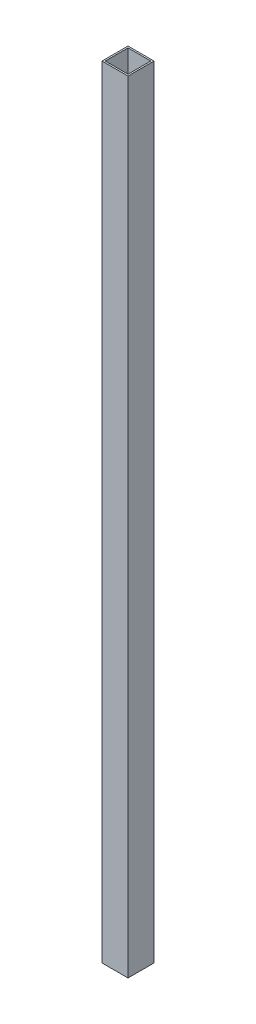
ISO-10303-21;
HEADER;
FILE_DESCRIPTION(('STEP AP214'),'2;1');
FILE_NAME('part.step','',(''),(''),'','','');
FILE_SCHEMA(('AUTOMOTIVE_DESIGN { 1 0 10303 214 1 1 1 1 }'));
ENDSEC;
DATA;
#1=APPLICATION_CONTEXT('core data for automotive mechanical design processes');
#2=APPLICATION_PROTOCOL_DEFINITION('international standard','automotive_design',2000,#1);
#3=PRODUCT_CONTEXT('',#1,'mechanical');
#4=PRODUCT('Part','Part','',(#3));
#5=PRODUCT_RELATED_PRODUCT_CATEGORY('part','',(#4));
#6=PRODUCT_DEFINITION_FORMATION('','',#4);
#7=PRODUCT_DEFINITION_CONTEXT('part definition',#1,'design');
#8=PRODUCT_DEFINITION('design','',#6,#7);
#9=PRODUCT_DEFINITION_SHAPE('','',#8);
#10=(LENGTH_UNIT() NAMED_UNIT(*) SI_UNIT(.MILLI.,.METRE.));
#11=(NAMED_UNIT(*) PLANE_ANGLE_UNIT() SI_UNIT($,.RADIAN.));
#12=(NAMED_UNIT(*) SI_UNIT($,.STERADIAN.) SOLID_ANGLE_UNIT());
#13=UNCERTAINTY_MEASURE_WITH_UNIT(LENGTH_MEASURE(1.E-05),#10,'distance_accuracy_value','');
#14=(GEOMETRIC_REPRESENTATION_CONTEXT(3) GLOBAL_UNCERTAINTY_ASSIGNED_CONTEXT((#13)) GLOBAL_UNIT_ASSIGNED_CONTEXT((#10,
#11,#12)) REPRESENTATION_CONTEXT('',''));
#15=CARTESIAN_POINT('',(0.,0.,0.));
#16=DIRECTION('',(0.,0.,1.));
#17=DIRECTION('',(1.,0.,0.));
#18=AXIS2_PLACEMENT_3D('',#15,#16,#17);
#19=CARTESIAN_POINT('',(0.,762.,0.));
#20=DIRECTION('',(0.,-1.,0.));
#21=DIRECTION('',(0.,0.,-1.));
#22=AXIS2_PLACEMENT_3D('',#19,#20,#21);
#23=PLANE('',#22);
#24=DIRECTION('',(0.,0.,1.));
#25=VECTOR('',#24,1.);
#26=CARTESIAN_POINT('',(0.,762.,0.));
#27=LINE('',#26,#25);
#28=CARTESIAN_POINT('',(0.,762.,-25.4));
#29=VERTEX_POINT('',#28);
#30=CARTESIAN_POINT('',(0.,762.,0.));
#31=VERTEX_POINT('',#30);
#32=EDGE_CURVE('E134',#29,#31,#27,.T.);
#33=ORIENTED_EDGE('',*,*,#32,.T.);
#34=DIRECTION('',(1.,0.,0.));
#35=VECTOR('',#34,1.);
#36=CARTESIAN_POINT('',(0.,762.,0.));
#37=LINE('',#36,#35);
#38=CARTESIAN_POINT('',(25.4,762.,0.));
#39=VERTEX_POINT('',#38);
#40=EDGE_CURVE('E137',#31,#39,#37,.T.);
#41=ORIENTED_EDGE('',*,*,#40,.T.);
#42=DIRECTION('',(0.,0.,-1.));
#43=VECTOR('',#42,1.);
#44=CARTESIAN_POINT('',(25.4,762.,0.));
#45=LINE('',#44,#43);
#46=CARTESIAN_POINT('',(25.4,762.,-25.4));
#47=VERTEX_POINT('',#46);
#48=EDGE_CURVE('E140',#39,#47,#45,.T.);
#49=ORIENTED_EDGE('',*,*,#48,.T.);
#50=DIRECTION('',(-1.,0.,0.));
#51=VECTOR('',#50,1.);
#52=CARTESIAN_POINT('',(0.,762.,-25.4));
#53=LINE('',#52,#51);
#54=EDGE_CURVE('E142',#47,#29,#53,.T.);
#55=ORIENTED_EDGE('',*,*,#54,.T.);
#56=EDGE_LOOP('',(#33,#41,#49,#55));
#57=FACE_BOUND('',#56,.T.);
#58=DIRECTION('',(0.,0.,1.));
#59=VECTOR('',#58,1.);
#60=CARTESIAN_POINT('',(1.5875,762.,-23.8125));
#61=LINE('',#60,#59);
#62=CARTESIAN_POINT('',(1.5875,762.,-23.8125));
#63=VERTEX_POINT('',#62);
#64=CARTESIAN_POINT('',(1.5875,762.,-1.5875));
#65=VERTEX_POINT('',#64);
#66=EDGE_CURVE('E98',#63,#65,#61,.T.);
#67=ORIENTED_EDGE('',*,*,#66,.F.);
#68=DIRECTION('',(-1.,0.,0.));
#69=VECTOR('',#68,1.);
#70=CARTESIAN_POINT('',(1.5875,762.,-23.8125));
#71=LINE('',#70,#69);
#72=CARTESIAN_POINT('',(23.8125,762.,-23.8125));
#73=VERTEX_POINT('',#72);
#74=EDGE_CURVE('E120',#73,#63,#71,.T.);
#75=ORIENTED_EDGE('',*,*,#74,.F.);
#76=DIRECTION('',(0.,0.,-1.));
#77=VECTOR('',#76,1.);
#78=CARTESIAN_POINT('',(23.8125,762.,-23.8125));
#79=LINE('',#78,#77);
#80=CARTESIAN_POINT('',(23.8125,762.,-1.5875));
#81=VERTEX_POINT('',#80);
#82=EDGE_CURVE('E118',#81,#73,#79,.T.);
#83=ORIENTED_EDGE('',*,*,#82,.F.);
#84=DIRECTION('',(1.,0.,0.));
#85=VECTOR('',#84,1.);
#86=CARTESIAN_POINT('',(1.5875,762.,-1.5875));
#87=LINE('',#86,#85);
#88=EDGE_CURVE('E106',#65,#81,#87,.T.);
#89=ORIENTED_EDGE('',*,*,#88,.F.);
#90=EDGE_LOOP('',(#67,#75,#83,#89));
#91=FACE_BOUND('',#90,.T.);
#92=ADVANCED_FACE('F33',(#57,#91),#23,.F.);
#93=CARTESIAN_POINT('',(0.,0.,0.));
#94=DIRECTION('',(0.,-1.,0.));
#95=DIRECTION('',(0.,0.,-1.));
#96=AXIS2_PLACEMENT_3D('',#93,#94,#95);
#97=PLANE('',#96);
#98=DIRECTION('',(0.,0.,1.));
#99=VECTOR('',#98,1.);
#100=CARTESIAN_POINT('',(0.,0.,0.));
#101=LINE('',#100,#99);
#102=CARTESIAN_POINT('',(0.,0.,-25.4));
#103=VERTEX_POINT('',#102);
#104=CARTESIAN_POINT('',(0.,0.,0.));
#105=VERTEX_POINT('',#104);
#106=EDGE_CURVE('E114',#103,#105,#101,.T.);
#107=ORIENTED_EDGE('',*,*,#106,.F.);
#108=DIRECTION('',(-1.,0.,0.));
#109=VECTOR('',#108,1.);
#110=CARTESIAN_POINT('',(0.,0.,-25.4));
#111=LINE('',#110,#109);
#112=CARTESIAN_POINT('',(25.4,0.,-25.4));
#113=VERTEX_POINT('',#112);
#114=EDGE_CURVE('E138',#113,#103,#111,.T.);
#115=ORIENTED_EDGE('',*,*,#114,.F.);
#116=DIRECTION('',(0.,0.,-1.));
#117=VECTOR('',#116,1.);
#118=CARTESIAN_POINT('',(25.4,0.,0.));
#119=LINE('',#118,#117);
#120=CARTESIAN_POINT('',(25.4,0.,0.));
#121=VERTEX_POINT('',#120);
#122=EDGE_CURVE('E149',#121,#113,#119,.T.);
#123=ORIENTED_EDGE('',*,*,#122,.F.);
#124=DIRECTION('',(1.,0.,0.));
#125=VECTOR('',#124,1.);
#126=CARTESIAN_POINT('',(0.,0.,0.));
#127=LINE('',#126,#125);
#128=EDGE_CURVE('E147',#105,#121,#127,.T.);
#129=ORIENTED_EDGE('',*,*,#128,.F.);
#130=EDGE_LOOP('',(#107,#115,#123,#129));
#131=FACE_BOUND('',#130,.T.);
#132=DIRECTION('',(-1.,0.,0.));
#133=VECTOR('',#132,1.);
#134=CARTESIAN_POINT('',(1.5875,0.,-23.8125));
#135=LINE('',#134,#133);
#136=CARTESIAN_POINT('',(23.8125,0.,-23.8125));
#137=VERTEX_POINT('',#136);
#138=CARTESIAN_POINT('',(1.5875,0.,-23.8125));
#139=VERTEX_POINT('',#138);
#140=EDGE_CURVE('E107',#137,#139,#135,.T.);
#141=ORIENTED_EDGE('',*,*,#140,.T.);
#142=DIRECTION('',(0.,0.,1.));
#143=VECTOR('',#142,1.);
#144=CARTESIAN_POINT('',(1.5875,0.,-23.8125));
#145=LINE('',#144,#143);
#146=CARTESIAN_POINT('',(1.5875,0.,-1.5875));
#147=VERTEX_POINT('',#146);
#148=EDGE_CURVE('E56',#139,#147,#145,.T.);
#149=ORIENTED_EDGE('',*,*,#148,.T.);
#150=DIRECTION('',(1.,0.,0.));
#151=VECTOR('',#150,1.);
#152=CARTESIAN_POINT('',(1.5875,0.,-1.5875));
#153=LINE('',#152,#151);
#154=CARTESIAN_POINT('',(23.8125,0.,-1.5875));
#155=VERTEX_POINT('',#154);
#156=EDGE_CURVE('E113',#147,#155,#153,.T.);
#157=ORIENTED_EDGE('',*,*,#156,.T.);
#158=DIRECTION('',(0.,0.,-1.));
#159=VECTOR('',#158,1.);
#160=CARTESIAN_POINT('',(23.8125,0.,-23.8125));
#161=LINE('',#160,#159);
#162=EDGE_CURVE('E126',#155,#137,#161,.T.);
#163=ORIENTED_EDGE('',*,*,#162,.T.);
#164=EDGE_LOOP('',(#141,#149,#157,#163));
#165=FACE_BOUND('',#164,.T.);
#166=ADVANCED_FACE('F167',(#131,#165),#97,.T.);
#167=CARTESIAN_POINT('',(0.,762.,0.));
#168=DIRECTION('',(1.,0.,0.));
#169=DIRECTION('',(0.,0.,-1.));
#170=AXIS2_PLACEMENT_3D('',#167,#168,#169);
#171=PLANE('',#170);
#172=ORIENTED_EDGE('',*,*,#106,.T.);
#173=DIRECTION('',(0.,-1.,0.));
#174=VECTOR('',#173,1.);
#175=CARTESIAN_POINT('',(0.,762.,0.));
#176=LINE('',#175,#174);
#177=EDGE_CURVE('E11',#31,#105,#176,.T.);
#178=ORIENTED_EDGE('',*,*,#177,.F.);
#179=ORIENTED_EDGE('',*,*,#32,.F.);
#180=DIRECTION('',(0.,-1.,0.));
#181=VECTOR('',#180,1.);
#182=CARTESIAN_POINT('',(0.,762.,-25.4));
#183=LINE('',#182,#181);
#184=EDGE_CURVE('E144',#29,#103,#183,.T.);
#185=ORIENTED_EDGE('',*,*,#184,.T.);
#186=EDGE_LOOP('',(#172,#178,#179,#185));
#187=FACE_BOUND('',#186,.T.);
#188=ADVANCED_FACE('F35',(#187),#171,.F.);
#189=CARTESIAN_POINT('',(0.,762.,0.));
#190=DIRECTION('',(0.,0.,-1.));
#191=DIRECTION('',(-1.,0.,0.));
#192=AXIS2_PLACEMENT_3D('',#189,#190,#191);
#193=PLANE('',#192);
#194=ORIENTED_EDGE('',*,*,#128,.T.);
#195=DIRECTION('',(0.,-1.,0.));
#196=VECTOR('',#195,1.);
#197=CARTESIAN_POINT('',(25.4,762.,0.));
#198=LINE('',#197,#196);
#199=EDGE_CURVE('E41',#39,#121,#198,.T.);
#200=ORIENTED_EDGE('',*,*,#199,.F.);
#201=ORIENTED_EDGE('',*,*,#40,.F.);
#202=ORIENTED_EDGE('',*,*,#177,.T.);
#203=EDGE_LOOP('',(#194,#200,#201,#202));
#204=FACE_BOUND('',#203,.T.);
#205=ADVANCED_FACE('F177',(#204),#193,.F.);
#206=CARTESIAN_POINT('',(25.4,762.,0.));
#207=DIRECTION('',(-1.,0.,0.));
#208=DIRECTION('',(0.,0.,1.));
#209=AXIS2_PLACEMENT_3D('',#206,#207,#208);
#210=PLANE('',#209);
#211=ORIENTED_EDGE('',*,*,#122,.T.);
#212=DIRECTION('',(0.,-1.,0.));
#213=VECTOR('',#212,1.);
#214=CARTESIAN_POINT('',(25.4,762.,-25.4));
#215=LINE('',#214,#213);
#216=EDGE_CURVE('E154',#47,#113,#215,.T.);
#217=ORIENTED_EDGE('',*,*,#216,.F.);
#218=ORIENTED_EDGE('',*,*,#48,.F.);
#219=ORIENTED_EDGE('',*,*,#199,.T.);
#220=EDGE_LOOP('',(#211,#217,#218,#219));
#221=FACE_BOUND('',#220,.T.);
#222=ADVANCED_FACE('F161',(#221),#210,.F.);
#223=CARTESIAN_POINT('',(0.,762.,-25.4));
#224=DIRECTION('',(0.,0.,1.));
#225=DIRECTION('',(1.,0.,0.));
#226=AXIS2_PLACEMENT_3D('',#223,#224,#225);
#227=PLANE('',#226);
#228=ORIENTED_EDGE('',*,*,#114,.T.);
#229=ORIENTED_EDGE('',*,*,#184,.F.);
#230=ORIENTED_EDGE('',*,*,#54,.F.);
#231=ORIENTED_EDGE('',*,*,#216,.T.);
#232=EDGE_LOOP('',(#228,#229,#230,#231));
#233=FACE_BOUND('',#232,.T.);
#234=ADVANCED_FACE('F171',(#233),#227,.F.);
#235=CARTESIAN_POINT('',(1.5875,762.,-23.8125));
#236=DIRECTION('',(1.,0.,0.));
#237=DIRECTION('',(0.,0.,-1.));
#238=AXIS2_PLACEMENT_3D('',#235,#236,#237);
#239=PLANE('',#238);
#240=ORIENTED_EDGE('',*,*,#148,.F.);
#241=DIRECTION('',(0.,-1.,0.));
#242=VECTOR('',#241,1.);
#243=CARTESIAN_POINT('',(1.5875,762.,-23.8125));
#244=LINE('',#243,#242);
#245=EDGE_CURVE('E102',#63,#139,#244,.T.);
#246=ORIENTED_EDGE('',*,*,#245,.F.);
#247=ORIENTED_EDGE('',*,*,#66,.T.);
#248=DIRECTION('',(0.,-1.,0.));
#249=VECTOR('',#248,1.);
#250=CARTESIAN_POINT('',(1.5875,762.,-1.5875));
#251=LINE('',#250,#249);
#252=EDGE_CURVE('E101',#65,#147,#251,.T.);
#253=ORIENTED_EDGE('',*,*,#252,.T.);
#254=EDGE_LOOP('',(#240,#246,#247,#253));
#255=FACE_BOUND('',#254,.T.);
#256=ADVANCED_FACE('F100',(#255),#239,.T.);
#257=CARTESIAN_POINT('',(1.5875,762.,-1.5875));
#258=DIRECTION('',(0.,0.,-1.));
#259=DIRECTION('',(-1.,0.,0.));
#260=AXIS2_PLACEMENT_3D('',#257,#258,#259);
#261=PLANE('',#260);
#262=ORIENTED_EDGE('',*,*,#156,.F.);
#263=ORIENTED_EDGE('',*,*,#252,.F.);
#264=ORIENTED_EDGE('',*,*,#88,.T.);
#265=DIRECTION('',(0.,-1.,0.));
#266=VECTOR('',#265,1.);
#267=CARTESIAN_POINT('',(23.8125,762.,-1.5875));
#268=LINE('',#267,#266);
#269=EDGE_CURVE('E115',#81,#155,#268,.T.);
#270=ORIENTED_EDGE('',*,*,#269,.T.);
#271=EDGE_LOOP('',(#262,#263,#264,#270));
#272=FACE_BOUND('',#271,.T.);
#273=ADVANCED_FACE('F110',(#272),#261,.T.);
#274=CARTESIAN_POINT('',(23.8125,762.,-23.8125));
#275=DIRECTION('',(-1.,0.,0.));
#276=DIRECTION('',(0.,0.,1.));
#277=AXIS2_PLACEMENT_3D('',#274,#275,#276);
#278=PLANE('',#277);
#279=ORIENTED_EDGE('',*,*,#162,.F.);
#280=ORIENTED_EDGE('',*,*,#269,.F.);
#281=ORIENTED_EDGE('',*,*,#82,.T.);
#282=DIRECTION('',(0.,-1.,0.));
#283=VECTOR('',#282,1.);
#284=CARTESIAN_POINT('',(23.8125,762.,-23.8125));
#285=LINE('',#284,#283);
#286=EDGE_CURVE('E48',#73,#137,#285,.T.);
#287=ORIENTED_EDGE('',*,*,#286,.T.);
#288=EDGE_LOOP('',(#279,#280,#281,#287));
#289=FACE_BOUND('',#288,.T.);
#290=ADVANCED_FACE('F200',(#289),#278,.T.);
#291=CARTESIAN_POINT('',(1.5875,762.,-23.8125));
#292=DIRECTION('',(0.,0.,1.));
#293=DIRECTION('',(1.,0.,0.));
#294=AXIS2_PLACEMENT_3D('',#291,#292,#293);
#295=PLANE('',#294);
#296=ORIENTED_EDGE('',*,*,#140,.F.);
#297=ORIENTED_EDGE('',*,*,#286,.F.);
#298=ORIENTED_EDGE('',*,*,#74,.T.);
#299=ORIENTED_EDGE('',*,*,#245,.T.);
#300=EDGE_LOOP('',(#296,#297,#298,#299));
#301=FACE_BOUND('',#300,.T.);
#302=ADVANCED_FACE('F204',(#301),#295,.T.);
#303=CLOSED_SHELL('',(#92,#166,#188,#205,#222,#234,#256,#273,#290,#302));
#304=MANIFOLD_SOLID_BREP('B2',#303);
#305=ADVANCED_BREP_SHAPE_REPRESENTATION('',(#18,#304),#14);
#306=SHAPE_DEFINITION_REPRESENTATION(#9,#305);
ENDSEC;
END-ISO-10303-21;
